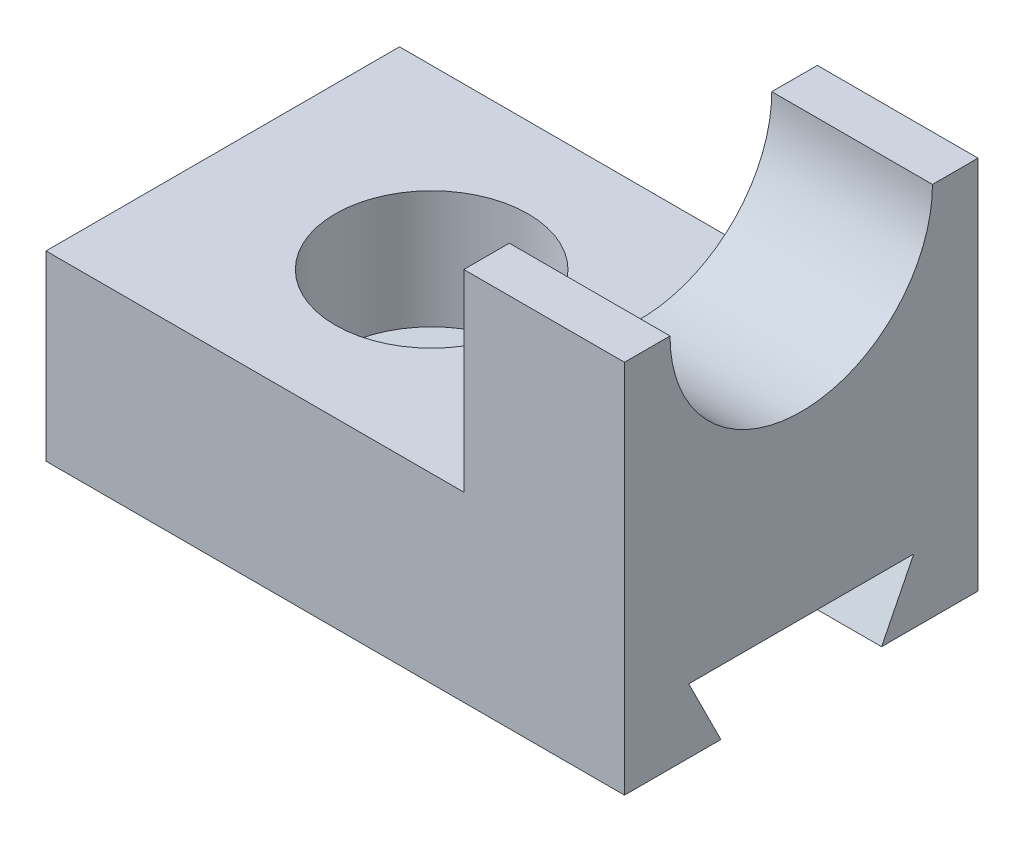
ISO-10303-21;
HEADER;
FILE_DESCRIPTION(('STEP AP214'),'2;1');
FILE_NAME('part.step','',(''),(''),'','','');
FILE_SCHEMA(('AUTOMOTIVE_DESIGN { 1 0 10303 214 1 1 1 1 }'));
ENDSEC;
DATA;
#1=APPLICATION_CONTEXT('core data for automotive mechanical design processes');
#2=APPLICATION_PROTOCOL_DEFINITION('international standard','automotive_design',2000,#1);
#3=PRODUCT_CONTEXT('',#1,'mechanical');
#4=PRODUCT('Part','Part','',(#3));
#5=PRODUCT_RELATED_PRODUCT_CATEGORY('part','',(#4));
#6=PRODUCT_DEFINITION_FORMATION('','',#4);
#7=PRODUCT_DEFINITION_CONTEXT('part definition',#1,'design');
#8=PRODUCT_DEFINITION('design','',#6,#7);
#9=PRODUCT_DEFINITION_SHAPE('','',#8);
#10=(LENGTH_UNIT() NAMED_UNIT(*) SI_UNIT(.MILLI.,.METRE.));
#11=(NAMED_UNIT(*) PLANE_ANGLE_UNIT() SI_UNIT($,.RADIAN.));
#12=(NAMED_UNIT(*) SI_UNIT($,.STERADIAN.) SOLID_ANGLE_UNIT());
#13=UNCERTAINTY_MEASURE_WITH_UNIT(LENGTH_MEASURE(1.E-05),#10,'distance_accuracy_value','');
#14=(GEOMETRIC_REPRESENTATION_CONTEXT(3) GLOBAL_UNCERTAINTY_ASSIGNED_CONTEXT((#13)) GLOBAL_UNIT_ASSIGNED_CONTEXT((#10,
#11,#12)) REPRESENTATION_CONTEXT('',''));
#15=CARTESIAN_POINT('',(0.,0.,0.));
#16=DIRECTION('',(0.,0.,1.));
#17=DIRECTION('',(1.,0.,0.));
#18=AXIS2_PLACEMENT_3D('',#15,#16,#17);
#19=CARTESIAN_POINT('',(0.,0.,0.));
#20=DIRECTION('',(0.,1.,0.));
#21=DIRECTION('',(0.,0.,1.));
#22=AXIS2_PLACEMENT_3D('',#19,#20,#21);
#23=PLANE('',#22);
#24=DIRECTION('',(0.,0.,1.));
#25=VECTOR('',#24,1.);
#26=CARTESIAN_POINT('',(54.,0.,0.));
#27=LINE('',#26,#25);
#28=CARTESIAN_POINT('',(54.,0.,-33.));
#29=VERTEX_POINT('',#28);
#30=CARTESIAN_POINT('',(54.,0.,-15.));
#31=VERTEX_POINT('',#30);
#32=EDGE_CURVE('E142',#29,#31,#27,.T.);
#33=ORIENTED_EDGE('',*,*,#32,.T.);
#34=DIRECTION('',(-1.,0.,0.));
#35=VECTOR('',#34,1.);
#36=CARTESIAN_POINT('',(54.001,0.,-15.));
#37=LINE('',#36,#35);
#38=CARTESIAN_POINT('',(-54.,0.,-15.));
#39=VERTEX_POINT('',#38);
#40=EDGE_CURVE('E124',#31,#39,#37,.T.);
#41=ORIENTED_EDGE('',*,*,#40,.T.);
#42=DIRECTION('',(0.,0.,1.));
#43=VECTOR('',#42,1.);
#44=CARTESIAN_POINT('',(-54.,0.,0.));
#45=LINE('',#44,#43);
#46=CARTESIAN_POINT('',(-54.,0.,-33.));
#47=VERTEX_POINT('',#46);
#48=EDGE_CURVE('E183',#47,#39,#45,.T.);
#49=ORIENTED_EDGE('',*,*,#48,.F.);
#50=DIRECTION('',(1.,0.,0.));
#51=VECTOR('',#50,1.);
#52=CARTESIAN_POINT('',(0.,0.,-33.));
#53=LINE('',#52,#51);
#54=EDGE_CURVE('E147',#47,#29,#53,.T.);
#55=ORIENTED_EDGE('',*,*,#54,.T.);
#56=EDGE_LOOP('',(#33,#41,#49,#55));
#57=FACE_BOUND('',#56,.T.);
#58=ADVANCED_FACE('F37',(#57),#23,.F.);
#59=CARTESIAN_POINT('',(0.,70.,0.));
#60=DIRECTION('',(0.,1.,0.));
#61=DIRECTION('',(0.,0.,1.));
#62=AXIS2_PLACEMENT_3D('',#59,#60,#61);
#63=PLANE('',#62);
#64=DIRECTION('',(-1.,0.,0.));
#65=VECTOR('',#64,1.);
#66=CARTESIAN_POINT('',(94.,70.,-24.5));
#67=LINE('',#66,#65);
#68=CARTESIAN_POINT('',(54.,70.,-24.5));
#69=VERTEX_POINT('',#68);
#70=CARTESIAN_POINT('',(24.,70.,-24.5));
#71=VERTEX_POINT('',#70);
#72=EDGE_CURVE('E11',#69,#71,#67,.T.);
#73=ORIENTED_EDGE('',*,*,#72,.F.);
#74=DIRECTION('',(0.,0.,1.));
#75=VECTOR('',#74,1.);
#76=CARTESIAN_POINT('',(54.,70.,0.));
#77=LINE('',#76,#75);
#78=CARTESIAN_POINT('',(54.,70.,-33.));
#79=VERTEX_POINT('',#78);
#80=EDGE_CURVE('E152',#79,#69,#77,.T.);
#81=ORIENTED_EDGE('',*,*,#80,.F.);
#82=DIRECTION('',(1.,0.,0.));
#83=VECTOR('',#82,1.);
#84=CARTESIAN_POINT('',(0.,70.,-33.));
#85=LINE('',#84,#83);
#86=CARTESIAN_POINT('',(24.,70.,-33.));
#87=VERTEX_POINT('',#86);
#88=EDGE_CURVE('E230',#87,#79,#85,.T.);
#89=ORIENTED_EDGE('',*,*,#88,.F.);
#90=DIRECTION('',(0.,0.,1.));
#91=VECTOR('',#90,1.);
#92=CARTESIAN_POINT('',(24.,70.,0.));
#93=LINE('',#92,#91);
#94=EDGE_CURVE('E209',#87,#71,#93,.T.);
#95=ORIENTED_EDGE('',*,*,#94,.T.);
#96=EDGE_LOOP('',(#73,#81,#89,#95));
#97=FACE_BOUND('',#96,.T.);
#98=ADVANCED_FACE('F236',(#97),#63,.T.);
#99=CARTESIAN_POINT('',(-54.,34.,0.));
#100=DIRECTION('',(1.,0.,0.));
#101=DIRECTION('',(0.,0.,-1.));
#102=AXIS2_PLACEMENT_3D('',#99,#100,#101);
#103=PLANE('',#102);
#104=ORIENTED_EDGE('',*,*,#48,.T.);
#105=DIRECTION('',(0.,-0.894427190999916,0.447213595499958));
#106=VECTOR('',#105,1.);
#107=CARTESIAN_POINT('',(-54.,12.,-21.));
#108=LINE('',#107,#106);
#109=CARTESIAN_POINT('',(-54.,12.,-21.));
#110=VERTEX_POINT('',#109);
#111=EDGE_CURVE('E130',#110,#39,#108,.T.);
#112=ORIENTED_EDGE('',*,*,#111,.F.);
#113=DIRECTION('',(0.,0.,-1.));
#114=VECTOR('',#113,1.);
#115=CARTESIAN_POINT('',(-54.,12.,21.));
#116=LINE('',#115,#114);
#117=CARTESIAN_POINT('',(-54.,12.,21.));
#118=VERTEX_POINT('',#117);
#119=EDGE_CURVE('E136',#118,#110,#116,.T.);
#120=ORIENTED_EDGE('',*,*,#119,.F.);
#121=DIRECTION('',(0.,0.894427190999916,0.447213595499958));
#122=VECTOR('',#121,1.);
#123=CARTESIAN_POINT('',(-54.,12.,21.));
#124=LINE('',#123,#122);
#125=CARTESIAN_POINT('',(-54.,0.,15.));
#126=VERTEX_POINT('',#125);
#127=EDGE_CURVE('E246',#126,#118,#124,.T.);
#128=ORIENTED_EDGE('',*,*,#127,.F.);
#129=CARTESIAN_POINT('',(-54.,0.,33.));
#130=VERTEX_POINT('',#129);
#131=EDGE_CURVE('E170',#126,#130,#45,.T.);
#132=ORIENTED_EDGE('',*,*,#131,.T.);
#133=DIRECTION('',(0.,-1.,0.));
#134=VECTOR('',#133,1.);
#135=CARTESIAN_POINT('',(-54.,34.,33.));
#136=LINE('',#135,#134);
#137=CARTESIAN_POINT('',(-54.,34.,33.));
#138=VERTEX_POINT('',#137);
#139=EDGE_CURVE('E190',#138,#130,#136,.T.);
#140=ORIENTED_EDGE('',*,*,#139,.F.);
#141=DIRECTION('',(0.,0.,1.));
#142=VECTOR('',#141,1.);
#143=CARTESIAN_POINT('',(-54.,34.,0.));
#144=LINE('',#143,#142);
#145=CARTESIAN_POINT('',(-54.,34.,-33.));
#146=VERTEX_POINT('',#145);
#147=EDGE_CURVE('E171',#146,#138,#144,.T.);
#148=ORIENTED_EDGE('',*,*,#147,.F.);
#149=DIRECTION('',(0.,-1.,0.));
#150=VECTOR('',#149,1.);
#151=CARTESIAN_POINT('',(-54.,34.,-33.));
#152=LINE('',#151,#150);
#153=EDGE_CURVE('E182',#146,#47,#152,.T.);
#154=ORIENTED_EDGE('',*,*,#153,.T.);
#155=EDGE_LOOP('',(#104,#112,#120,#128,#132,#140,#148,#154));
#156=FACE_BOUND('',#155,.T.);
#157=ADVANCED_FACE('F39',(#156),#103,.F.);
#158=CARTESIAN_POINT('',(0.,34.,33.));
#159=DIRECTION('',(0.,0.,-1.));
#160=DIRECTION('',(-1.,0.,0.));
#161=AXIS2_PLACEMENT_3D('',#158,#159,#160);
#162=PLANE('',#161);
#163=DIRECTION('',(1.,0.,0.));
#164=VECTOR('',#163,1.);
#165=CARTESIAN_POINT('',(0.,0.,33.));
#166=LINE('',#165,#164);
#167=CARTESIAN_POINT('',(54.,0.,33.));
#168=VERTEX_POINT('',#167);
#169=EDGE_CURVE('E185',#130,#168,#166,.T.);
#170=ORIENTED_EDGE('',*,*,#169,.T.);
#171=DIRECTION('',(0.,-1.,0.));
#172=VECTOR('',#171,1.);
#173=CARTESIAN_POINT('',(54.,70.,33.));
#174=LINE('',#173,#172);
#175=CARTESIAN_POINT('',(54.,70.,33.));
#176=VERTEX_POINT('',#175);
#177=EDGE_CURVE('E159',#176,#168,#174,.T.);
#178=ORIENTED_EDGE('',*,*,#177,.F.);
#179=DIRECTION('',(1.,0.,0.));
#180=VECTOR('',#179,1.);
#181=CARTESIAN_POINT('',(0.,70.,33.));
#182=LINE('',#181,#180);
#183=CARTESIAN_POINT('',(24.,70.,33.));
#184=VERTEX_POINT('',#183);
#185=EDGE_CURVE('E157',#184,#176,#182,.T.);
#186=ORIENTED_EDGE('',*,*,#185,.F.);
#187=DIRECTION('',(0.,-1.,0.));
#188=VECTOR('',#187,1.);
#189=CARTESIAN_POINT('',(24.,70.,33.));
#190=LINE('',#189,#188);
#191=CARTESIAN_POINT('',(24.,34.,33.));
#192=VERTEX_POINT('',#191);
#193=EDGE_CURVE('E162',#184,#192,#190,.T.);
#194=ORIENTED_EDGE('',*,*,#193,.T.);
#195=DIRECTION('',(1.,0.,0.));
#196=VECTOR('',#195,1.);
#197=CARTESIAN_POINT('',(0.,34.,33.));
#198=LINE('',#197,#196);
#199=EDGE_CURVE('E174',#138,#192,#198,.T.);
#200=ORIENTED_EDGE('',*,*,#199,.F.);
#201=ORIENTED_EDGE('',*,*,#139,.T.);
#202=EDGE_LOOP('',(#170,#178,#186,#194,#200,#201));
#203=FACE_BOUND('',#202,.T.);
#204=ADVANCED_FACE('F210',(#203),#162,.F.);
#205=CARTESIAN_POINT('',(0.,34.,-33.));
#206=DIRECTION('',(0.,0.,-1.));
#207=DIRECTION('',(-1.,0.,0.));
#208=AXIS2_PLACEMENT_3D('',#205,#206,#207);
#209=PLANE('',#208);
#210=ORIENTED_EDGE('',*,*,#54,.F.);
#211=ORIENTED_EDGE('',*,*,#153,.F.);
#212=DIRECTION('',(1.,0.,0.));
#213=VECTOR('',#212,1.);
#214=CARTESIAN_POINT('',(0.,34.,-33.));
#215=LINE('',#214,#213);
#216=CARTESIAN_POINT('',(24.,34.,-33.));
#217=VERTEX_POINT('',#216);
#218=EDGE_CURVE('E179',#146,#217,#215,.T.);
#219=ORIENTED_EDGE('',*,*,#218,.T.);
#220=DIRECTION('',(0.,-1.,0.));
#221=VECTOR('',#220,1.);
#222=CARTESIAN_POINT('',(24.,70.,-33.));
#223=LINE('',#222,#221);
#224=EDGE_CURVE('E165',#87,#217,#223,.T.);
#225=ORIENTED_EDGE('',*,*,#224,.F.);
#226=ORIENTED_EDGE('',*,*,#88,.T.);
#227=DIRECTION('',(0.,-1.,0.));
#228=VECTOR('',#227,1.);
#229=CARTESIAN_POINT('',(54.,70.,-33.));
#230=LINE('',#229,#228);
#231=EDGE_CURVE('E168',#79,#29,#230,.T.);
#232=ORIENTED_EDGE('',*,*,#231,.T.);
#233=EDGE_LOOP('',(#210,#211,#219,#225,#226,#232));
#234=FACE_BOUND('',#233,.T.);
#235=ADVANCED_FACE('F254',(#234),#209,.T.);
#236=CARTESIAN_POINT('',(0.,34.,0.));
#237=DIRECTION('',(0.,1.,0.));
#238=DIRECTION('',(0.,0.,1.));
#239=AXIS2_PLACEMENT_3D('',#236,#237,#238);
#240=PLANE('',#239);
#241=CARTESIAN_POINT('',(-15.,34.,0.));
#242=DIRECTION('',(0.,1.,0.));
#243=DIRECTION('',(0.,0.,1.));
#244=AXIS2_PLACEMENT_3D('',#241,#242,#243);
#245=CIRCLE('',#244,18.);
#246=CARTESIAN_POINT('',(-15.,34.,18.));
#247=VERTEX_POINT('',#246);
#248=EDGE_CURVE('E154',#247,#247,#245,.T.);
#249=ORIENTED_EDGE('',*,*,#248,.F.);
#250=EDGE_LOOP('',(#249));
#251=FACE_BOUND('',#250,.T.);
#252=ORIENTED_EDGE('',*,*,#147,.T.);
#253=ORIENTED_EDGE('',*,*,#199,.T.);
#254=DIRECTION('',(0.,0.,1.));
#255=VECTOR('',#254,1.);
#256=CARTESIAN_POINT('',(24.,34.,0.));
#257=LINE('',#256,#255);
#258=EDGE_CURVE('E176',#217,#192,#257,.T.);
#259=ORIENTED_EDGE('',*,*,#258,.F.);
#260=ORIENTED_EDGE('',*,*,#218,.F.);
#261=EDGE_LOOP('',(#252,#253,#259,#260));
#262=FACE_BOUND('',#261,.T.);
#263=ADVANCED_FACE('F243',(#251,#262),#240,.T.);
#264=ORIENTED_EDGE('',*,*,#131,.F.);
#265=DIRECTION('',(-1.,0.,0.));
#266=VECTOR('',#265,1.);
#267=CARTESIAN_POINT('',(54.001,0.,15.));
#268=LINE('',#267,#266);
#269=CARTESIAN_POINT('',(54.,0.,15.));
#270=VERTEX_POINT('',#269);
#271=EDGE_CURVE('E135',#270,#126,#268,.T.);
#272=ORIENTED_EDGE('',*,*,#271,.F.);
#273=EDGE_CURVE('E150',#270,#168,#27,.T.);
#274=ORIENTED_EDGE('',*,*,#273,.T.);
#275=ORIENTED_EDGE('',*,*,#169,.F.);
#276=EDGE_LOOP('',(#264,#272,#274,#275));
#277=FACE_BOUND('',#276,.T.);
#278=ADVANCED_FACE('F217',(#277),#23,.F.);
#279=CARTESIAN_POINT('',(24.,70.,0.));
#280=DIRECTION('',(1.,0.,0.));
#281=DIRECTION('',(0.,0.,-1.));
#282=AXIS2_PLACEMENT_3D('',#279,#280,#281);
#283=PLANE('',#282);
#284=CARTESIAN_POINT('',(24.,70.,24.5));
#285=VERTEX_POINT('',#284);
#286=EDGE_CURVE('E206',#285,#184,#93,.T.);
#287=ORIENTED_EDGE('',*,*,#286,.F.);
#288=CARTESIAN_POINT('',(24.,70.,0.));
#289=DIRECTION('',(-1.,0.,0.));
#290=DIRECTION('',(0.,0.,1.));
#291=AXIS2_PLACEMENT_3D('',#288,#289,#290);
#292=CIRCLE('',#291,24.5);
#293=EDGE_CURVE('E59',#71,#285,#292,.T.);
#294=ORIENTED_EDGE('',*,*,#293,.F.);
#295=ORIENTED_EDGE('',*,*,#94,.F.);
#296=ORIENTED_EDGE('',*,*,#224,.T.);
#297=ORIENTED_EDGE('',*,*,#258,.T.);
#298=ORIENTED_EDGE('',*,*,#193,.F.);
#299=EDGE_LOOP('',(#287,#294,#295,#296,#297,#298));
#300=FACE_BOUND('',#299,.T.);
#301=ADVANCED_FACE('F238',(#300),#283,.F.);
#302=CARTESIAN_POINT('',(54.,70.,0.));
#303=DIRECTION('',(1.,0.,0.));
#304=DIRECTION('',(0.,0.,-1.));
#305=AXIS2_PLACEMENT_3D('',#302,#303,#304);
#306=PLANE('',#305);
#307=DIRECTION('',(0.,-0.894427190999916,0.447213595499958));
#308=VECTOR('',#307,1.);
#309=CARTESIAN_POINT('',(54.,12.,-21.));
#310=LINE('',#309,#308);
#311=CARTESIAN_POINT('',(54.,12.,-21.));
#312=VERTEX_POINT('',#311);
#313=EDGE_CURVE('E127',#312,#31,#310,.T.);
#314=ORIENTED_EDGE('',*,*,#313,.T.);
#315=ORIENTED_EDGE('',*,*,#32,.F.);
#316=ORIENTED_EDGE('',*,*,#231,.F.);
#317=ORIENTED_EDGE('',*,*,#80,.T.);
#318=CARTESIAN_POINT('',(54.,70.,0.));
#319=DIRECTION('',(1.,0.,0.));
#320=DIRECTION('',(0.,0.,-1.));
#321=AXIS2_PLACEMENT_3D('',#318,#319,#320);
#322=CIRCLE('',#321,24.5);
#323=CARTESIAN_POINT('',(54.,70.,24.5));
#324=VERTEX_POINT('',#323);
#325=EDGE_CURVE('E194',#324,#69,#322,.T.);
#326=ORIENTED_EDGE('',*,*,#325,.F.);
#327=EDGE_CURVE('E149',#324,#176,#77,.T.);
#328=ORIENTED_EDGE('',*,*,#327,.T.);
#329=ORIENTED_EDGE('',*,*,#177,.T.);
#330=ORIENTED_EDGE('',*,*,#273,.F.);
#331=DIRECTION('',(0.,0.894427190999916,0.447213595499958));
#332=VECTOR('',#331,1.);
#333=CARTESIAN_POINT('',(54.,12.,21.));
#334=LINE('',#333,#332);
#335=CARTESIAN_POINT('',(54.,12.,21.));
#336=VERTEX_POINT('',#335);
#337=EDGE_CURVE('E213',#270,#336,#334,.T.);
#338=ORIENTED_EDGE('',*,*,#337,.T.);
#339=DIRECTION('',(0.,0.,-1.));
#340=VECTOR('',#339,1.);
#341=CARTESIAN_POINT('',(54.,12.,21.));
#342=LINE('',#341,#340);
#343=EDGE_CURVE('E144',#336,#312,#342,.T.);
#344=ORIENTED_EDGE('',*,*,#343,.T.);
#345=EDGE_LOOP('',(#314,#315,#316,#317,#326,#328,#329,#330,#338,#344));
#346=FACE_BOUND('',#345,.T.);
#347=ADVANCED_FACE('F141',(#346),#306,.T.);
#348=DIRECTION('',(-1.,0.,0.));
#349=VECTOR('',#348,1.);
#350=CARTESIAN_POINT('',(94.,70.,24.5));
#351=LINE('',#350,#349);
#352=EDGE_CURVE('E45',#285,#324,#351,.F.);
#353=ORIENTED_EDGE('',*,*,#352,.F.);
#354=ORIENTED_EDGE('',*,*,#286,.T.);
#355=ORIENTED_EDGE('',*,*,#185,.T.);
#356=ORIENTED_EDGE('',*,*,#327,.F.);
#357=EDGE_LOOP('',(#353,#354,#355,#356));
#358=FACE_BOUND('',#357,.T.);
#359=ADVANCED_FACE('F203',(#358),#63,.T.);
#360=CARTESIAN_POINT('',(-15.,11.,0.));
#361=DIRECTION('',(0.,1.,0.));
#362=DIRECTION('',(0.,0.,1.));
#363=AXIS2_PLACEMENT_3D('',#360,#361,#362);
#364=CYLINDRICAL_SURFACE('',#363,18.);
#365=CARTESIAN_POINT('',(-15.,12.,0.));
#366=DIRECTION('',(0.,1.,0.));
#367=DIRECTION('',(0.,0.,1.));
#368=AXIS2_PLACEMENT_3D('',#365,#366,#367);
#369=CIRCLE('',#368,18.);
#370=CARTESIAN_POINT('',(-15.,12.,18.));
#371=VERTEX_POINT('',#370);
#372=EDGE_CURVE('E224',#371,#371,#369,.T.);
#373=CARTESIAN_POINT('',(-15.,12.,18.));
#374=CARTESIAN_POINT('',(-15.,12.2291666666667,18.));
#375=CARTESIAN_POINT('',(-15.,12.4583333333333,18.));
#376=CARTESIAN_POINT('',(-15.,12.9166666666667,18.));
#377=CARTESIAN_POINT('',(-15.,13.1458333333333,18.));
#378=CARTESIAN_POINT('',(-15.,13.6041666666667,18.));
#379=CARTESIAN_POINT('',(-15.,13.8333333333333,18.));
#380=CARTESIAN_POINT('',(-15.,14.2916666666667,18.));
#381=CARTESIAN_POINT('',(-15.,14.5208333333333,18.));
#382=CARTESIAN_POINT('',(-15.,14.9791666666667,18.));
#383=CARTESIAN_POINT('',(-15.,15.2083333333333,18.));
#384=CARTESIAN_POINT('',(-15.,15.6666666666667,18.));
#385=CARTESIAN_POINT('',(-15.,15.8958333333333,18.));
#386=CARTESIAN_POINT('',(-15.,16.3541666666667,18.));
#387=CARTESIAN_POINT('',(-15.,16.5833333333333,18.));
#388=CARTESIAN_POINT('',(-15.,17.0416666666667,18.));
#389=CARTESIAN_POINT('',(-15.,17.2708333333333,18.));
#390=CARTESIAN_POINT('',(-15.,17.7291666666667,18.));
#391=CARTESIAN_POINT('',(-15.,17.9583333333333,18.));
#392=CARTESIAN_POINT('',(-15.,18.4166666666667,18.));
#393=CARTESIAN_POINT('',(-15.,18.6458333333333,18.));
#394=CARTESIAN_POINT('',(-15.,19.1041666666667,18.));
#395=CARTESIAN_POINT('',(-15.,19.3333333333333,18.));
#396=CARTESIAN_POINT('',(-15.,19.7916666666667,18.));
#397=CARTESIAN_POINT('',(-15.,20.0208333333333,18.));
#398=CARTESIAN_POINT('',(-15.,20.4791666666667,18.));
#399=CARTESIAN_POINT('',(-15.,20.7083333333333,18.));
#400=CARTESIAN_POINT('',(-15.,21.1666666666667,18.));
#401=CARTESIAN_POINT('',(-15.,21.3958333333333,18.));
#402=CARTESIAN_POINT('',(-15.,21.8541666666667,18.));
#403=CARTESIAN_POINT('',(-15.,22.0833333333333,18.));
#404=CARTESIAN_POINT('',(-15.,22.5416666666667,18.));
#405=CARTESIAN_POINT('',(-15.,22.7708333333333,18.));
#406=CARTESIAN_POINT('',(-15.,23.2291666666667,18.));
#407=CARTESIAN_POINT('',(-15.,23.4583333333333,18.));
#408=CARTESIAN_POINT('',(-15.,23.9166666666667,18.));
#409=CARTESIAN_POINT('',(-15.,24.1458333333333,18.));
#410=CARTESIAN_POINT('',(-15.,24.6041666666667,18.));
#411=CARTESIAN_POINT('',(-15.,24.8333333333333,18.));
#412=CARTESIAN_POINT('',(-15.,25.2916666666667,18.));
#413=CARTESIAN_POINT('',(-15.,25.5208333333333,18.));
#414=CARTESIAN_POINT('',(-15.,25.9791666666667,18.));
#415=CARTESIAN_POINT('',(-15.,26.2083333333333,18.));
#416=CARTESIAN_POINT('',(-15.,26.6666666666667,18.));
#417=CARTESIAN_POINT('',(-15.,26.8958333333333,18.));
#418=CARTESIAN_POINT('',(-15.,27.3541666666667,18.));
#419=CARTESIAN_POINT('',(-15.,27.5833333333333,18.));
#420=CARTESIAN_POINT('',(-15.,28.0416666666667,18.));
#421=CARTESIAN_POINT('',(-15.,28.2708333333333,18.));
#422=CARTESIAN_POINT('',(-15.,28.7291666666667,18.));
#423=CARTESIAN_POINT('',(-15.,28.9583333333333,18.));
#424=CARTESIAN_POINT('',(-15.,29.4166666666667,18.));
#425=CARTESIAN_POINT('',(-15.,29.6458333333333,18.));
#426=CARTESIAN_POINT('',(-15.,30.1041666666667,18.));
#427=CARTESIAN_POINT('',(-15.,30.3333333333333,18.));
#428=CARTESIAN_POINT('',(-15.,30.7916666666667,18.));
#429=CARTESIAN_POINT('',(-15.,31.0208333333333,18.));
#430=CARTESIAN_POINT('',(-15.,31.4791666666667,18.));
#431=CARTESIAN_POINT('',(-15.,31.7083333333333,18.));
#432=CARTESIAN_POINT('',(-15.,32.1666666666667,18.));
#433=CARTESIAN_POINT('',(-15.,32.3958333333333,18.));
#434=CARTESIAN_POINT('',(-15.,32.8541666666667,18.));
#435=CARTESIAN_POINT('',(-15.,33.0833333333333,18.));
#436=CARTESIAN_POINT('',(-15.,33.5416666666667,18.));
#437=CARTESIAN_POINT('',(-15.,33.7708333333333,18.));
#438=CARTESIAN_POINT('',(-15.,34.,18.));
#439=B_SPLINE_CURVE_WITH_KNOTS('',3,(#373,#374,#375,#376,#377,#378,#379,#380,#381,#382,#383,
#384,#385,#386,#387,#388,#389,#390,#391,#392,#393,#394,#395,#396,#397,#398,#399,#400,#401,#402,
#403,#404,#405,#406,#407,#408,#409,#410,#411,#412,#413,#414,#415,#416,#417,#418,#419,#420,#421,
#422,#423,#424,#425,#426,#427,#428,#429,#430,#431,#432,#433,#434,#435,#436,#437,#438),
.UNSPECIFIED.,.F.,.F.,(4,2,2,2,2,2,2,2,2,2,2,2,2,2,2,2,2,2,2,2,2,2,2,2,2,2,2,2,2,2,2,2,4),(0.,
0.687499999999999,1.375,2.0625,2.75,3.4375,4.125,4.8125,5.5,6.1875,6.875,7.5625,8.25,8.9375,
9.625,10.3125,11.,11.6875,12.375,13.0625,13.75,14.4375,15.125,15.8125,16.5,17.1875,17.875,
18.5625,19.25,19.9375,20.625,21.3125,22.),.UNSPECIFIED.);
#440=EDGE_CURVE('BSEAM280',#371,#247,#439,.T.);
#441=ORIENTED_EDGE('',*,*,#372,.F.);
#442=ORIENTED_EDGE('',*,*,#248,.T.);
#443=ORIENTED_EDGE('',*,*,#440,.T.);
#444=ORIENTED_EDGE('',*,*,#440,.F.);
#445=EDGE_LOOP('',(#441,#443,#442,#444));
#446=FACE_BOUND('',#445,.T.);
#447=ADVANCED_FACE('F280',(#446),#364,.F.);
#448=CARTESIAN_POINT('',(94.,70.,0.));
#449=DIRECTION('',(-1.,0.,0.));
#450=DIRECTION('',(0.,0.,1.));
#451=AXIS2_PLACEMENT_3D('',#448,#449,#450);
#452=CYLINDRICAL_SURFACE('',#451,24.5);
#453=ORIENTED_EDGE('',*,*,#72,.T.);
#454=ORIENTED_EDGE('',*,*,#293,.T.);
#455=ORIENTED_EDGE('',*,*,#352,.T.);
#456=ORIENTED_EDGE('',*,*,#325,.T.);
#457=EDGE_LOOP('',(#453,#454,#455,#456));
#458=FACE_BOUND('',#457,.T.);
#459=ADVANCED_FACE('F193',(#458),#452,.F.);
#460=CARTESIAN_POINT('',(54.001,12.,21.));
#461=DIRECTION('',(0.,1.,0.));
#462=DIRECTION('',(0.,0.,1.));
#463=AXIS2_PLACEMENT_3D('',#460,#461,#462);
#464=PLANE('',#463);
#465=ORIENTED_EDGE('',*,*,#372,.T.);
#466=EDGE_LOOP('',(#465));
#467=FACE_BOUND('',#466,.T.);
#468=DIRECTION('',(-1.,0.,0.));
#469=VECTOR('',#468,1.);
#470=CARTESIAN_POINT('',(54.001,12.,21.));
#471=LINE('',#470,#469);
#472=EDGE_CURVE('E52',#336,#118,#471,.T.);
#473=ORIENTED_EDGE('',*,*,#472,.T.);
#474=ORIENTED_EDGE('',*,*,#119,.T.);
#475=DIRECTION('',(-1.,0.,0.));
#476=VECTOR('',#475,1.);
#477=CARTESIAN_POINT('',(54.001,12.,-21.));
#478=LINE('',#477,#476);
#479=EDGE_CURVE('E220',#312,#110,#478,.T.);
#480=ORIENTED_EDGE('',*,*,#479,.F.);
#481=ORIENTED_EDGE('',*,*,#343,.F.);
#482=EDGE_LOOP('',(#473,#474,#480,#481));
#483=FACE_BOUND('',#482,.T.);
#484=ADVANCED_FACE('F252',(#467,#483),#464,.F.);
#485=CARTESIAN_POINT('',(54.001,12.,-21.));
#486=DIRECTION('',(0.,-0.447213595499958,-0.894427190999916));
#487=DIRECTION('',(0.,0.894427190999916,-0.447213595499958));
#488=AXIS2_PLACEMENT_3D('',#485,#486,#487);
#489=PLANE('',#488);
#490=ORIENTED_EDGE('',*,*,#479,.T.);
#491=ORIENTED_EDGE('',*,*,#111,.T.);
#492=ORIENTED_EDGE('',*,*,#40,.F.);
#493=ORIENTED_EDGE('',*,*,#313,.F.);
#494=EDGE_LOOP('',(#490,#491,#492,#493));
#495=FACE_BOUND('',#494,.T.);
#496=ADVANCED_FACE('F126',(#495),#489,.F.);
#497=CARTESIAN_POINT('',(54.001,12.,21.));
#498=DIRECTION('',(0.,-0.447213595499958,0.894427190999916));
#499=DIRECTION('',(0.,-0.894427190999916,-0.447213595499958));
#500=AXIS2_PLACEMENT_3D('',#497,#498,#499);
#501=PLANE('',#500);
#502=ORIENTED_EDGE('',*,*,#271,.T.);
#503=ORIENTED_EDGE('',*,*,#127,.T.);
#504=ORIENTED_EDGE('',*,*,#472,.F.);
#505=ORIENTED_EDGE('',*,*,#337,.F.);
#506=EDGE_LOOP('',(#502,#503,#504,#505));
#507=FACE_BOUND('',#506,.T.);
#508=ADVANCED_FACE('F288',(#507),#501,.F.);
#509=CLOSED_SHELL('',(#58,#98,#157,#204,#235,#263,#278,#301,#347,#359,#447,#459,#484,#496,#508));
#510=MANIFOLD_SOLID_BREP('B2',#509);
#511=ADVANCED_BREP_SHAPE_REPRESENTATION('',(#18,#510),#14);
#512=SHAPE_DEFINITION_REPRESENTATION(#9,#511);
ENDSEC;
END-ISO-10303-21;
